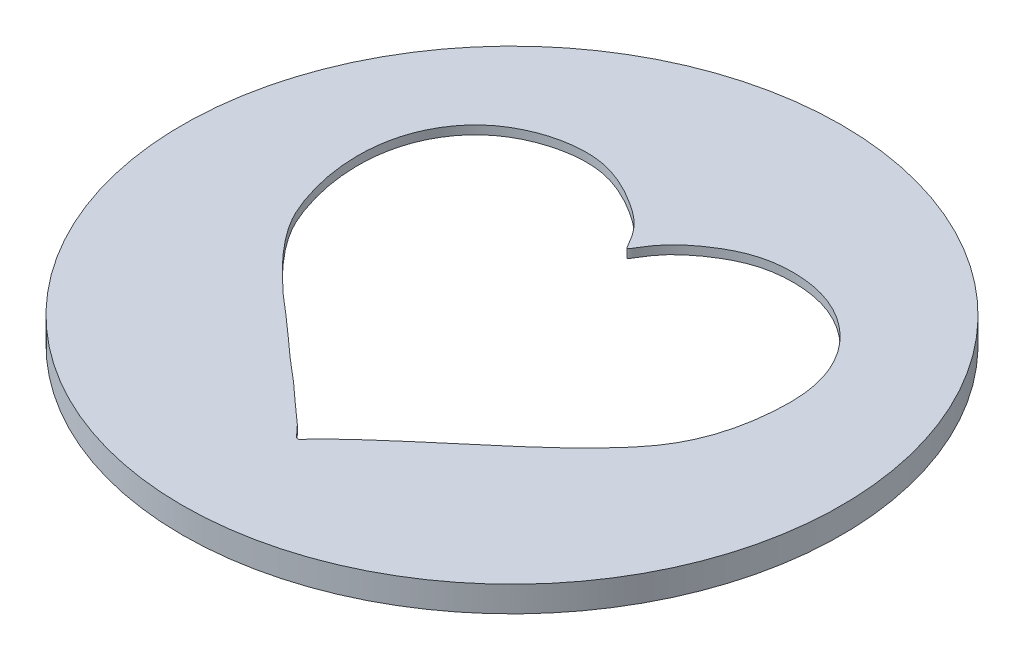
ISO-10303-21;
HEADER;
FILE_DESCRIPTION(('STEP AP214'),'2;1');
FILE_NAME('part.step','',(''),(''),'','','');
FILE_SCHEMA(('AUTOMOTIVE_DESIGN { 1 0 10303 214 1 1 1 1 }'));
ENDSEC;
DATA;
#1=APPLICATION_CONTEXT('core data for automotive mechanical design processes');
#2=APPLICATION_PROTOCOL_DEFINITION('international standard','automotive_design',2000,#1);
#3=PRODUCT_CONTEXT('',#1,'mechanical');
#4=PRODUCT('Part','Part','',(#3));
#5=PRODUCT_RELATED_PRODUCT_CATEGORY('part','',(#4));
#6=PRODUCT_DEFINITION_FORMATION('','',#4);
#7=PRODUCT_DEFINITION_CONTEXT('part definition',#1,'design');
#8=PRODUCT_DEFINITION('design','',#6,#7);
#9=PRODUCT_DEFINITION_SHAPE('','',#8);
#10=(LENGTH_UNIT() NAMED_UNIT(*) SI_UNIT(.MILLI.,.METRE.));
#11=(NAMED_UNIT(*) PLANE_ANGLE_UNIT() SI_UNIT($,.RADIAN.));
#12=(NAMED_UNIT(*) SI_UNIT($,.STERADIAN.) SOLID_ANGLE_UNIT());
#13=UNCERTAINTY_MEASURE_WITH_UNIT(LENGTH_MEASURE(1.E-05),#10,'distance_accuracy_value','');
#14=(GEOMETRIC_REPRESENTATION_CONTEXT(3) GLOBAL_UNCERTAINTY_ASSIGNED_CONTEXT((#13)) GLOBAL_UNIT_ASSIGNED_CONTEXT((#10,
#11,#12)) REPRESENTATION_CONTEXT('',''));
#15=CARTESIAN_POINT('',(0.,0.,0.));
#16=DIRECTION('',(0.,0.,1.));
#17=DIRECTION('',(1.,0.,0.));
#18=AXIS2_PLACEMENT_3D('',#15,#16,#17);
#19=CARTESIAN_POINT('',(35.,0.,-20.));
#20=DIRECTION('',(0.,1.,0.));
#21=DIRECTION('',(0.,0.,1.));
#22=AXIS2_PLACEMENT_3D('',#19,#20,#21);
#23=PLANE('',#22);
#24=CARTESIAN_POINT('',(9.84767784092869,0.,-26.963736175445));
#25=CARTESIAN_POINT('',(9.87052690524742,0.,-24.5958149285957));
#26=CARTESIAN_POINT('',(10.535707516911,0.,-21.1850653730392));
#27=CARTESIAN_POINT('',(12.2609338202186,0.,-16.9635824803509));
#28=CARTESIAN_POINT('',(14.0189356151491,0.,-14.4537585200643));
#29=CARTESIAN_POINT('',(15.8704275197302,0.,-12.2954686328372));
#30=CARTESIAN_POINT('',(17.8172804300821,0.,-10.3336974919002));
#31=CARTESIAN_POINT('',(20.046157182374,0.,-8.22229175054119));
#32=CARTESIAN_POINT('',(22.7988112433884,0.,-6.01223397424892));
#33=CARTESIAN_POINT('',(25.7613502814458,0.,-3.14654820777222));
#34=CARTESIAN_POINT('',(28.9375444047476,0.,-0.616488039199228));
#35=CARTESIAN_POINT('',(31.9126481894555,0.,2.23210171507736));
#36=CARTESIAN_POINT('',(33.6784886421728,0.,3.62022567580838));
#37=CARTESIAN_POINT('',(35.0289555001722,0.,5.31750734543982));
#38=CARTESIAN_POINT('',(35.709778404774,0.,4.25653481541702));
#39=CARTESIAN_POINT('',(36.73688284148,0.,3.32476937082834));
#40=CARTESIAN_POINT('',(40.5704347710114,0.,-0.326439576175648));
#41=CARTESIAN_POINT('',(46.8073879358829,0.,-5.34147001122352));
#42=CARTESIAN_POINT('',(53.4398774986312,0.,-11.3634382590194));
#43=CARTESIAN_POINT('',(58.5840596489761,0.,-17.3183587055318));
#44=CARTESIAN_POINT('',(60.2338363681139,0.,-24.3524621898797));
#45=CARTESIAN_POINT('',(60.01377513181,0.,-31.2515945015888));
#46=CARTESIAN_POINT('',(57.2902192909776,0.,-36.8273342920584));
#47=CARTESIAN_POINT('',(52.3750177533188,0.,-40.1747387813708));
#48=CARTESIAN_POINT('',(47.4929335192287,0.,-40.9038904955225));
#49=CARTESIAN_POINT('',(44.0936192006065,0.,-40.5736557951162));
#50=CARTESIAN_POINT('',(41.2160862837784,0.,-39.4694320171506));
#51=CARTESIAN_POINT('',(38.001750758044,0.,-37.3880232354383));
#52=CARTESIAN_POINT('',(36.3118931072072,0.,-35.6925366846062));
#53=CARTESIAN_POINT('',(34.9905059361426,0.,-33.3201962634662));
#54=CARTESIAN_POINT('',(33.6001239266815,0.,-35.9703170491803));
#55=CARTESIAN_POINT('',(31.0101920923374,0.,-38.1127413121373));
#56=CARTESIAN_POINT('',(25.7064453096465,0.,-40.9707428558029));
#57=CARTESIAN_POINT('',(19.5425330604654,0.,-40.8305255189276));
#58=CARTESIAN_POINT('',(13.7303245767387,0.,-38.1574886630048));
#59=CARTESIAN_POINT('',(10.3286253282912,0.,-32.599497458936));
#60=CARTESIAN_POINT('',(9.83028097915946,0.,-28.7666283218023));
#61=CARTESIAN_POINT('',(9.84767784092869,0.,-26.963736175445));
#62=B_SPLINE_CURVE_WITH_KNOTS('',3,(#24,#25,#26,#27,#28,#29,#30,#31,#32,#33,#34,#35,#36,#37,#38,
#39,#40,#41,#42,#43,#44,#45,#46,#47,#48,#49,#50,#51,#52,#53,#54,#55,#56,#57,#58,#59,#60,#61),
.UNSPECIFIED.,.T.,.F.,(4,1,1,1,1,1,1,1,1,1,1,1,1,1,1,1,1,1,1,1,1,1,1,1,1,1,1,1,1,1,1,1,1,1,1,4),
(0.,0.0454467728512834,0.06585350670606,0.0875330521227179,0.104119240250935,0.120655407089686,
0.140776379985768,0.163253201657253,0.188681603152975,0.219924769523702,0.242355560907376,
0.265338475455503,0.270051680810135,0.275235603667892,0.283846298413192,0.29646855202405,
0.383393951796499,0.432411718446319,0.470618368472337,0.532843852735662,0.565761392802002,
0.602424758212022,0.64811372807363,0.673670609882335,0.696531206145781,0.712946710379931,
0.733079284293149,0.767331806208481,0.769861550988559,0.772651586300789,0.809819152324699,
0.849164438225836,0.879797598358582,0.926768885680726,0.965397654183017,1.),.UNSPECIFIED.);
#63=CARTESIAN_POINT('',(9.84767784092869,0.,-26.963736175445));
#64=VERTEX_POINT('',#63);
#65=EDGE_CURVE('E44',#64,#64,#62,.T.);
#66=ORIENTED_EDGE('',*,*,#65,.T.);
#67=EDGE_LOOP('',(#66));
#68=FACE_BOUND('',#67,.T.);
#69=CARTESIAN_POINT('',(35.,0.,-20.));
#70=DIRECTION('',(0.,-1.,0.));
#71=DIRECTION('',(0.,0.,-1.));
#72=AXIS2_PLACEMENT_3D('',#69,#70,#71);
#73=CIRCLE('',#72,37.5);
#74=CARTESIAN_POINT('',(35.,0.,-57.5));
#75=VERTEX_POINT('',#74);
#76=EDGE_CURVE('E77',#75,#75,#73,.T.);
#77=ORIENTED_EDGE('',*,*,#76,.T.);
#78=EDGE_LOOP('',(#77));
#79=FACE_BOUND('',#78,.T.);
#80=ADVANCED_FACE('F33',(#68,#79),#23,.F.);
#81=CARTESIAN_POINT('',(35.,1.,-20.));
#82=DIRECTION('',(0.,1.,0.));
#83=DIRECTION('',(0.,0.,1.));
#84=AXIS2_PLACEMENT_3D('',#81,#82,#83);
#85=PLANE('',#84);
#86=CARTESIAN_POINT('',(35.,1.,-20.));
#87=DIRECTION('',(0.,1.,0.));
#88=DIRECTION('',(0.,0.,1.));
#89=AXIS2_PLACEMENT_3D('',#86,#87,#88);
#90=CIRCLE('',#89,38.5);
#91=CARTESIAN_POINT('',(35.,1.,18.5));
#92=VERTEX_POINT('',#91);
#93=EDGE_CURVE('E10',#92,#92,#90,.T.);
#94=ORIENTED_EDGE('',*,*,#93,.T.);
#95=EDGE_LOOP('',(#94));
#96=FACE_BOUND('',#95,.T.);
#97=CARTESIAN_POINT('',(9.84767784092869,1.,-26.963736175445));
#98=CARTESIAN_POINT('',(9.87052690524742,1.,-24.5958149285957));
#99=CARTESIAN_POINT('',(10.535707516911,1.,-21.1850653730392));
#100=CARTESIAN_POINT('',(12.2609338202186,1.,-16.9635824803509));
#101=CARTESIAN_POINT('',(14.0189356151491,1.,-14.4537585200643));
#102=CARTESIAN_POINT('',(15.8704275197302,1.,-12.2954686328372));
#103=CARTESIAN_POINT('',(17.8172804300821,1.,-10.3336974919002));
#104=CARTESIAN_POINT('',(20.046157182374,1.,-8.22229175054119));
#105=CARTESIAN_POINT('',(22.7988112433884,1.,-6.01223397424892));
#106=CARTESIAN_POINT('',(25.7613502814458,1.,-3.14654820777222));
#107=CARTESIAN_POINT('',(28.9375444047476,1.,-0.616488039199228));
#108=CARTESIAN_POINT('',(31.9126481894555,1.,2.23210171507736));
#109=CARTESIAN_POINT('',(33.6784886421728,1.,3.62022567580838));
#110=CARTESIAN_POINT('',(35.0289555001722,1.,5.31750734543982));
#111=CARTESIAN_POINT('',(35.709778404774,1.,4.25653481541702));
#112=CARTESIAN_POINT('',(36.73688284148,1.,3.32476937082834));
#113=CARTESIAN_POINT('',(40.5704347710114,1.,-0.326439576175648));
#114=CARTESIAN_POINT('',(46.8073879358829,1.,-5.34147001122352));
#115=CARTESIAN_POINT('',(53.4398774986312,1.,-11.3634382590194));
#116=CARTESIAN_POINT('',(58.5840596489761,1.,-17.3183587055318));
#117=CARTESIAN_POINT('',(60.2338363681139,1.,-24.3524621898797));
#118=CARTESIAN_POINT('',(60.01377513181,1.,-31.2515945015888));
#119=CARTESIAN_POINT('',(57.2902192909776,1.,-36.8273342920584));
#120=CARTESIAN_POINT('',(52.3750177533188,1.,-40.1747387813708));
#121=CARTESIAN_POINT('',(47.4929335192287,1.,-40.9038904955225));
#122=CARTESIAN_POINT('',(44.0936192006065,1.,-40.5736557951162));
#123=CARTESIAN_POINT('',(41.2160862837784,1.,-39.4694320171506));
#124=CARTESIAN_POINT('',(38.001750758044,1.,-37.3880232354383));
#125=CARTESIAN_POINT('',(36.3118931072072,1.,-35.6925366846062));
#126=CARTESIAN_POINT('',(34.9905059361426,1.,-33.3201962634662));
#127=CARTESIAN_POINT('',(33.6001239266815,1.,-35.9703170491803));
#128=CARTESIAN_POINT('',(31.0101920923374,1.,-38.1127413121373));
#129=CARTESIAN_POINT('',(25.7064453096465,1.,-40.9707428558029));
#130=CARTESIAN_POINT('',(19.5425330604654,1.,-40.8305255189276));
#131=CARTESIAN_POINT('',(13.7303245767387,1.,-38.1574886630048));
#132=CARTESIAN_POINT('',(10.3286253282912,1.,-32.599497458936));
#133=CARTESIAN_POINT('',(9.83028097915946,1.,-28.7666283218023));
#134=CARTESIAN_POINT('',(9.84767784092869,1.,-26.963736175445));
#135=B_SPLINE_CURVE_WITH_KNOTS('',3,(#97,#98,#99,#100,#101,#102,#103,#104,#105,#106,#107,#108,
#109,#110,#111,#112,#113,#114,#115,#116,#117,#118,#119,#120,#121,#122,#123,#124,#125,#126,#127,
#128,#129,#130,#131,#132,#133,#134),.UNSPECIFIED.,.T.,.F.,(4,1,1,1,1,1,1,1,1,1,1,1,1,1,1,1,1,1,
1,1,1,1,1,1,1,1,1,1,1,1,1,1,1,1,1,4),(0.,0.0454467728512834,0.06585350670606,0.0875330521227179,
0.104119240250935,0.120655407089686,0.140776379985768,0.163253201657253,0.188681603152975,
0.219924769523702,0.242355560907376,0.265338475455503,0.270051680810135,0.275235603667892,
0.283846298413192,0.29646855202405,0.383393951796499,0.432411718446319,0.470618368472337,
0.532843852735662,0.565761392802002,0.602424758212022,0.64811372807363,0.673670609882335,
0.696531206145781,0.712946710379931,0.733079284293149,0.767331806208481,0.769861550988559,
0.772651586300789,0.809819152324699,0.849164438225836,0.879797598358582,0.926768885680726,
0.965397654183017,1.),.UNSPECIFIED.);
#136=CARTESIAN_POINT('',(9.84767784092869,1.,-26.963736175445));
#137=VERTEX_POINT('',#136);
#138=EDGE_CURVE('E40',#137,#137,#135,.T.);
#139=ORIENTED_EDGE('',*,*,#138,.F.);
#140=EDGE_LOOP('',(#139));
#141=FACE_BOUND('',#140,.T.);
#142=ADVANCED_FACE('F67',(#96,#141),#85,.T.);
#143=CARTESIAN_POINT('',(35.,1.,-20.));
#144=DIRECTION('',(0.,-1.,0.));
#145=DIRECTION('',(0.,0.,-1.));
#146=AXIS2_PLACEMENT_3D('',#143,#144,#145);
#147=CYLINDRICAL_SURFACE('',#146,38.5);
#148=ORIENTED_EDGE('',*,*,#93,.F.);
#149=EDGE_LOOP('',(#148));
#150=FACE_BOUND('',#149,.T.);
#151=CARTESIAN_POINT('',(35.,-2.,-20.));
#152=DIRECTION('',(0.,-1.,0.));
#153=DIRECTION('',(0.,0.,-1.));
#154=AXIS2_PLACEMENT_3D('',#151,#152,#153);
#155=CIRCLE('',#154,38.5);
#156=CARTESIAN_POINT('',(35.,-2.,-58.5));
#157=VERTEX_POINT('',#156);
#158=EDGE_CURVE('E49',#157,#157,#155,.T.);
#159=ORIENTED_EDGE('',*,*,#158,.F.);
#160=EDGE_LOOP('',(#159));
#161=FACE_BOUND('',#160,.T.);
#162=ADVANCED_FACE('F35',(#150,#161),#147,.T.);
#163=DIRECTION('',(0.,-1.,0.));
#164=VECTOR('',#163,1.);
#165=SURFACE_OF_LINEAR_EXTRUSION('',#135,#164);
#166=ORIENTED_EDGE('',*,*,#138,.T.);
#167=EDGE_LOOP('',(#166));
#168=FACE_BOUND('',#167,.T.);
#169=ORIENTED_EDGE('',*,*,#65,.F.);
#170=EDGE_LOOP('',(#169));
#171=FACE_BOUND('',#170,.T.);
#172=ADVANCED_FACE('F61',(#168,#171),#165,.T.);
#173=CARTESIAN_POINT('',(35.,-2.,-20.));
#174=DIRECTION('',(0.,-1.,0.));
#175=DIRECTION('',(0.,0.,-1.));
#176=AXIS2_PLACEMENT_3D('',#173,#174,#175);
#177=PLANE('',#176);
#178=ORIENTED_EDGE('',*,*,#158,.T.);
#179=EDGE_LOOP('',(#178));
#180=FACE_BOUND('',#179,.T.);
#181=CARTESIAN_POINT('',(35.,-2.,-20.));
#182=DIRECTION('',(0.,-1.,0.));
#183=DIRECTION('',(0.,0.,-1.));
#184=AXIS2_PLACEMENT_3D('',#181,#182,#183);
#185=CIRCLE('',#184,37.5);
#186=CARTESIAN_POINT('',(35.,-2.,-57.5));
#187=VERTEX_POINT('',#186);
#188=EDGE_CURVE('E79',#187,#187,#185,.T.);
#189=ORIENTED_EDGE('',*,*,#188,.F.);
#190=EDGE_LOOP('',(#189));
#191=FACE_BOUND('',#190,.T.);
#192=ADVANCED_FACE('F65',(#180,#191),#177,.T.);
#193=CARTESIAN_POINT('',(35.,-2.,-20.));
#194=DIRECTION('',(0.,1.,0.));
#195=DIRECTION('',(0.,0.,1.));
#196=AXIS2_PLACEMENT_3D('',#193,#194,#195);
#197=CYLINDRICAL_SURFACE('',#196,37.5);
#198=ORIENTED_EDGE('',*,*,#188,.T.);
#199=EDGE_LOOP('',(#198));
#200=FACE_BOUND('',#199,.T.);
#201=ORIENTED_EDGE('',*,*,#76,.F.);
#202=EDGE_LOOP('',(#201));
#203=FACE_BOUND('',#202,.T.);
#204=ADVANCED_FACE('F105',(#200,#203),#197,.F.);
#205=CLOSED_SHELL('',(#80,#142,#162,#172,#192,#204));
#206=MANIFOLD_SOLID_BREP('B2',#205);
#207=ADVANCED_BREP_SHAPE_REPRESENTATION('',(#18,#206),#14);
#208=SHAPE_DEFINITION_REPRESENTATION(#9,#207);
ENDSEC;
END-ISO-10303-21;
